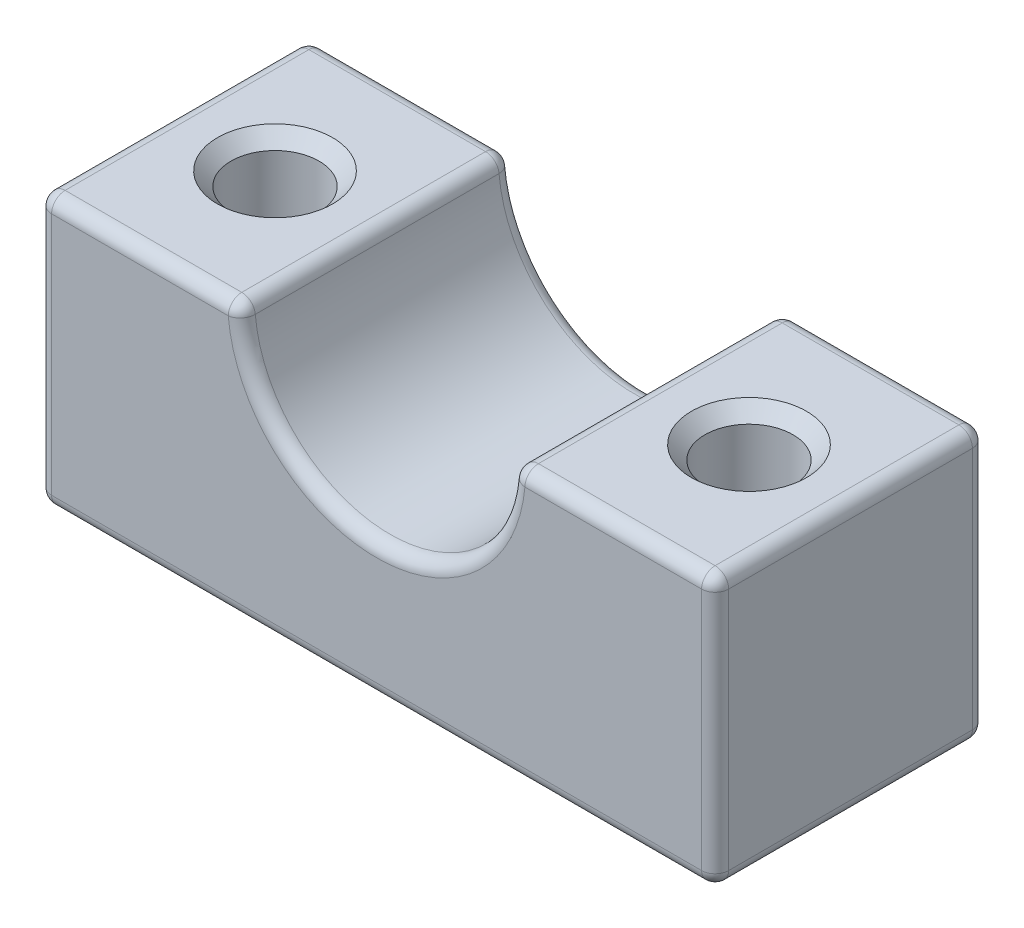
ISO-10303-21;
HEADER;
FILE_DESCRIPTION(('STEP AP214'),'2;1');
FILE_NAME('part.step','',(''),(''),'','','');
FILE_SCHEMA(('AUTOMOTIVE_DESIGN { 1 0 10303 214 1 1 1 1 }'));
ENDSEC;
DATA;
#1=APPLICATION_CONTEXT('core data for automotive mechanical design processes');
#2=APPLICATION_PROTOCOL_DEFINITION('international standard','automotive_design',2000,#1);
#3=PRODUCT_CONTEXT('',#1,'mechanical');
#4=PRODUCT('Part','Part','',(#3));
#5=PRODUCT_RELATED_PRODUCT_CATEGORY('part','',(#4));
#6=PRODUCT_DEFINITION_FORMATION('','',#4);
#7=PRODUCT_DEFINITION_CONTEXT('part definition',#1,'design');
#8=PRODUCT_DEFINITION('design','',#6,#7);
#9=PRODUCT_DEFINITION_SHAPE('','',#8);
#10=(LENGTH_UNIT() NAMED_UNIT(*) SI_UNIT(.MILLI.,.METRE.));
#11=(NAMED_UNIT(*) PLANE_ANGLE_UNIT() SI_UNIT($,.RADIAN.));
#12=(NAMED_UNIT(*) SI_UNIT($,.STERADIAN.) SOLID_ANGLE_UNIT());
#13=UNCERTAINTY_MEASURE_WITH_UNIT(LENGTH_MEASURE(1.E-05),#10,'distance_accuracy_value','');
#14=(GEOMETRIC_REPRESENTATION_CONTEXT(3) GLOBAL_UNCERTAINTY_ASSIGNED_CONTEXT((#13)) GLOBAL_UNIT_ASSIGNED_CONTEXT((#10,
#11,#12)) REPRESENTATION_CONTEXT('',''));
#15=CARTESIAN_POINT('',(0.,0.,0.));
#16=DIRECTION('',(0.,0.,1.));
#17=DIRECTION('',(1.,0.,0.));
#18=AXIS2_PLACEMENT_3D('',#15,#16,#17);
#19=CARTESIAN_POINT('',(0.,0.,40.));
#20=DIRECTION('',(0.,0.,-1.));
#21=DIRECTION('',(-1.,0.,0.));
#22=AXIS2_PLACEMENT_3D('',#19,#20,#21);
#23=CYLINDRICAL_SURFACE('',#22,20.);
#24=DIRECTION('',(0.,0.,-1.));
#25=VECTOR('',#24,1.);
#26=CARTESIAN_POINT('',(19.9171839092788,-1.81818181818182,40.));
#27=LINE('',#26,#25);
#28=CARTESIAN_POINT('',(19.9171839092788,-1.81818181818182,38.));
#29=VERTEX_POINT('',#28);
#30=CARTESIAN_POINT('',(19.9171839092788,-1.81818181818182,2.));
#31=VERTEX_POINT('',#30);
#32=EDGE_CURVE('E183',#29,#31,#27,.T.);
#33=ORIENTED_EDGE('',*,*,#32,.T.);
#34=CARTESIAN_POINT('',(0.,0.,2.));
#35=DIRECTION('',(0.,0.,1.));
#36=DIRECTION('',(1.,0.,0.));
#37=AXIS2_PLACEMENT_3D('',#34,#35,#36);
#38=CIRCLE('',#37,20.);
#39=CARTESIAN_POINT('',(-19.9171839092788,-1.81818181818182,2.));
#40=VERTEX_POINT('',#39);
#41=EDGE_CURVE('E178',#31,#40,#38,.F.);
#42=ORIENTED_EDGE('',*,*,#41,.T.);
#43=DIRECTION('',(0.,0.,-1.));
#44=VECTOR('',#43,1.);
#45=CARTESIAN_POINT('',(-19.9171839092788,-1.81818181818182,40.));
#46=LINE('',#45,#44);
#47=CARTESIAN_POINT('',(-19.9171839092788,-1.81818181818182,38.));
#48=VERTEX_POINT('',#47);
#49=EDGE_CURVE('E171',#40,#48,#46,.F.);
#50=ORIENTED_EDGE('',*,*,#49,.T.);
#51=CARTESIAN_POINT('',(0.,0.,38.));
#52=DIRECTION('',(0.,0.,1.));
#53=DIRECTION('',(1.,0.,0.));
#54=AXIS2_PLACEMENT_3D('',#51,#52,#53);
#55=CIRCLE('',#54,20.);
#56=EDGE_CURVE('E175',#48,#29,#55,.T.);
#57=ORIENTED_EDGE('',*,*,#56,.T.);
#58=EDGE_LOOP('',(#33,#42,#50,#57));
#59=FACE_BOUND('',#58,.T.);
#60=ADVANCED_FACE('F46',(#59),#23,.F.);
#61=CARTESIAN_POINT('',(0.,0.,40.));
#62=DIRECTION('',(0.,1.,0.));
#63=DIRECTION('',(0.,0.,1.));
#64=AXIS2_PLACEMENT_3D('',#61,#62,#63);
#65=PLANE('',#64);
#66=DIRECTION('',(0.,0.,-1.));
#67=VECTOR('',#66,1.);
#68=CARTESIAN_POINT('',(-21.9089023002067,0.,40.));
#69=LINE('',#68,#67);
#70=CARTESIAN_POINT('',(-21.9089023002067,0.,38.));
#71=VERTEX_POINT('',#70);
#72=CARTESIAN_POINT('',(-21.9089023002067,0.,2.));
#73=VERTEX_POINT('',#72);
#74=EDGE_CURVE('E191',#71,#73,#69,.T.);
#75=ORIENTED_EDGE('',*,*,#74,.T.);
#76=DIRECTION('',(1.,0.,0.));
#77=VECTOR('',#76,1.);
#78=CARTESIAN_POINT('',(-50.,0.,2.));
#79=LINE('',#78,#77);
#80=CARTESIAN_POINT('',(-48.,0.,2.));
#81=VERTEX_POINT('',#80);
#82=EDGE_CURVE('E245',#73,#81,#79,.F.);
#83=ORIENTED_EDGE('',*,*,#82,.T.);
#84=DIRECTION('',(0.,0.,-1.));
#85=VECTOR('',#84,1.);
#86=CARTESIAN_POINT('',(-48.,0.,40.));
#87=LINE('',#86,#85);
#88=CARTESIAN_POINT('',(-48.,0.,38.));
#89=VERTEX_POINT('',#88);
#90=EDGE_CURVE('E240',#81,#89,#87,.F.);
#91=ORIENTED_EDGE('',*,*,#90,.T.);
#92=DIRECTION('',(1.,0.,0.));
#93=VECTOR('',#92,1.);
#94=CARTESIAN_POINT('',(0.,0.,38.));
#95=LINE('',#94,#93);
#96=EDGE_CURVE('E237',#89,#71,#95,.T.);
#97=ORIENTED_EDGE('',*,*,#96,.T.);
#98=EDGE_LOOP('',(#75,#83,#91,#97));
#99=FACE_BOUND('',#98,.T.);
#100=CARTESIAN_POINT('',(-35.,0.,20.));
#101=DIRECTION('',(0.,1.,0.));
#102=DIRECTION('',(0.,0.,1.));
#103=AXIS2_PLACEMENT_3D('',#100,#101,#102);
#104=CIRCLE('',#103,8.50000000000004);
#105=CARTESIAN_POINT('',(-35.,0.,28.5));
#106=VERTEX_POINT('',#105);
#107=EDGE_CURVE('E474',#106,#106,#104,.F.);
#108=ORIENTED_EDGE('',*,*,#107,.T.);
#109=EDGE_LOOP('',(#108));
#110=FACE_BOUND('',#109,.T.);
#111=ADVANCED_FACE('F518',(#99,#110),#65,.T.);
#112=CARTESIAN_POINT('',(-50.,0.,40.));
#113=DIRECTION('',(-1.,0.,0.));
#114=DIRECTION('',(0.,0.,1.));
#115=AXIS2_PLACEMENT_3D('',#112,#113,#114);
#116=PLANE('',#115);
#117=DIRECTION('',(0.,0.,-1.));
#118=VECTOR('',#117,1.);
#119=CARTESIAN_POINT('',(-50.,-2.,40.));
#120=LINE('',#119,#118);
#121=CARTESIAN_POINT('',(-50.,-2.,38.));
#122=VERTEX_POINT('',#121);
#123=CARTESIAN_POINT('',(-50.,-2.,2.));
#124=VERTEX_POINT('',#123);
#125=EDGE_CURVE('E254',#122,#124,#120,.T.);
#126=ORIENTED_EDGE('',*,*,#125,.T.);
#127=DIRECTION('',(0.,1.,0.));
#128=VECTOR('',#127,1.);
#129=CARTESIAN_POINT('',(-50.,-40.,2.));
#130=LINE('',#129,#128);
#131=CARTESIAN_POINT('',(-50.,-38.,2.));
#132=VERTEX_POINT('',#131);
#133=EDGE_CURVE('E258',#124,#132,#130,.F.);
#134=ORIENTED_EDGE('',*,*,#133,.T.);
#135=DIRECTION('',(0.,0.,-1.));
#136=VECTOR('',#135,1.);
#137=CARTESIAN_POINT('',(-50.,-38.,40.));
#138=LINE('',#137,#136);
#139=CARTESIAN_POINT('',(-50.,-38.,38.));
#140=VERTEX_POINT('',#139);
#141=EDGE_CURVE('E251',#132,#140,#138,.F.);
#142=ORIENTED_EDGE('',*,*,#141,.T.);
#143=DIRECTION('',(0.,1.,0.));
#144=VECTOR('',#143,1.);
#145=CARTESIAN_POINT('',(-50.,0.,38.));
#146=LINE('',#145,#144);
#147=EDGE_CURVE('E248',#140,#122,#146,.T.);
#148=ORIENTED_EDGE('',*,*,#147,.T.);
#149=EDGE_LOOP('',(#126,#134,#142,#148));
#150=FACE_BOUND('',#149,.T.);
#151=ADVANCED_FACE('F524',(#150),#116,.T.);
#152=CARTESIAN_POINT('',(0.,-40.,40.));
#153=DIRECTION('',(0.,1.,0.));
#154=DIRECTION('',(-1.,0.,0.));
#155=AXIS2_PLACEMENT_3D('',#152,#153,#154);
#156=PLANE('',#155);
#157=DIRECTION('',(1.,0.,0.));
#158=VECTOR('',#157,1.);
#159=CARTESIAN_POINT('',(-50.,-40.,38.));
#160=LINE('',#159,#158);
#161=CARTESIAN_POINT('',(48.,-40.,38.));
#162=VERTEX_POINT('',#161);
#163=CARTESIAN_POINT('',(-48.,-40.,38.));
#164=VERTEX_POINT('',#163);
#165=EDGE_CURVE('E261',#162,#164,#160,.F.);
#166=ORIENTED_EDGE('',*,*,#165,.T.);
#167=DIRECTION('',(0.,0.,-1.));
#168=VECTOR('',#167,1.);
#169=CARTESIAN_POINT('',(-48.,-40.,0.));
#170=LINE('',#169,#168);
#171=CARTESIAN_POINT('',(-48.,-40.,2.));
#172=VERTEX_POINT('',#171);
#173=EDGE_CURVE('E270',#164,#172,#170,.T.);
#174=ORIENTED_EDGE('',*,*,#173,.T.);
#175=DIRECTION('',(1.,0.,0.));
#176=VECTOR('',#175,1.);
#177=CARTESIAN_POINT('',(0.,-40.,2.));
#178=LINE('',#177,#176);
#179=CARTESIAN_POINT('',(48.,-40.,2.));
#180=VERTEX_POINT('',#179);
#181=EDGE_CURVE('E267',#172,#180,#178,.T.);
#182=ORIENTED_EDGE('',*,*,#181,.T.);
#183=DIRECTION('',(0.,0.,-1.));
#184=VECTOR('',#183,1.);
#185=CARTESIAN_POINT('',(48.,-40.,40.));
#186=LINE('',#185,#184);
#187=EDGE_CURVE('E264',#180,#162,#186,.F.);
#188=ORIENTED_EDGE('',*,*,#187,.T.);
#189=EDGE_LOOP('',(#166,#174,#182,#188));
#190=FACE_BOUND('',#189,.T.);
#191=CARTESIAN_POINT('',(-35.,-40.,20.));
#192=DIRECTION('',(0.,1.,0.));
#193=DIRECTION('',(-1.,0.,0.));
#194=AXIS2_PLACEMENT_3D('',#191,#192,#193);
#195=CIRCLE('',#194,8.49999999999999);
#196=CARTESIAN_POINT('',(-43.5,-40.,20.));
#197=VERTEX_POINT('',#196);
#198=EDGE_CURVE('E470',#197,#197,#195,.T.);
#199=ORIENTED_EDGE('',*,*,#198,.T.);
#200=EDGE_LOOP('',(#199));
#201=FACE_BOUND('',#200,.T.);
#202=CARTESIAN_POINT('',(35.,-40.,20.));
#203=DIRECTION('',(0.,1.,0.));
#204=DIRECTION('',(-1.,0.,0.));
#205=AXIS2_PLACEMENT_3D('',#202,#203,#204);
#206=CIRCLE('',#205,8.50000000000001);
#207=CARTESIAN_POINT('',(26.5,-40.,20.));
#208=VERTEX_POINT('',#207);
#209=EDGE_CURVE('E466',#208,#208,#206,.T.);
#210=ORIENTED_EDGE('',*,*,#209,.T.);
#211=EDGE_LOOP('',(#210));
#212=FACE_BOUND('',#211,.T.);
#213=CARTESIAN_POINT('',(0.,-40.,30.));
#214=DIRECTION('',(0.,1.,0.));
#215=DIRECTION('',(-1.,0.,0.));
#216=AXIS2_PLACEMENT_3D('',#213,#214,#215);
#217=CIRCLE('',#216,6.99999999999999);
#218=CARTESIAN_POINT('',(-7.,-40.,30.));
#219=VERTEX_POINT('',#218);
#220=EDGE_CURVE('E462',#219,#219,#217,.T.);
#221=ORIENTED_EDGE('',*,*,#220,.T.);
#222=EDGE_LOOP('',(#221));
#223=FACE_BOUND('',#222,.T.);
#224=ADVANCED_FACE('F686',(#190,#201,#212,#223),#156,.F.);
#225=CARTESIAN_POINT('',(50.,0.,40.));
#226=DIRECTION('',(-1.,0.,0.));
#227=DIRECTION('',(0.,0.,1.));
#228=AXIS2_PLACEMENT_3D('',#225,#226,#227);
#229=PLANE('',#228);
#230=DIRECTION('',(0.,0.,-1.));
#231=VECTOR('',#230,1.);
#232=CARTESIAN_POINT('',(50.,-38.,40.));
#233=LINE('',#232,#231);
#234=CARTESIAN_POINT('',(50.,-38.,38.));
#235=VERTEX_POINT('',#234);
#236=CARTESIAN_POINT('',(50.,-38.,2.));
#237=VERTEX_POINT('',#236);
#238=EDGE_CURVE('E299',#235,#237,#233,.T.);
#239=ORIENTED_EDGE('',*,*,#238,.T.);
#240=DIRECTION('',(0.,1.,0.));
#241=VECTOR('',#240,1.);
#242=CARTESIAN_POINT('',(50.,0.,2.));
#243=LINE('',#242,#241);
#244=CARTESIAN_POINT('',(50.,-2.,2.));
#245=VERTEX_POINT('',#244);
#246=EDGE_CURVE('E303',#237,#245,#243,.T.);
#247=ORIENTED_EDGE('',*,*,#246,.T.);
#248=DIRECTION('',(0.,0.,-1.));
#249=VECTOR('',#248,1.);
#250=CARTESIAN_POINT('',(50.,-2.,40.));
#251=LINE('',#250,#249);
#252=CARTESIAN_POINT('',(50.,-2.,38.));
#253=VERTEX_POINT('',#252);
#254=EDGE_CURVE('E296',#245,#253,#251,.F.);
#255=ORIENTED_EDGE('',*,*,#254,.T.);
#256=DIRECTION('',(0.,1.,0.));
#257=VECTOR('',#256,1.);
#258=CARTESIAN_POINT('',(50.,-40.,38.));
#259=LINE('',#258,#257);
#260=EDGE_CURVE('E293',#253,#235,#259,.F.);
#261=ORIENTED_EDGE('',*,*,#260,.T.);
#262=EDGE_LOOP('',(#239,#247,#255,#261));
#263=FACE_BOUND('',#262,.T.);
#264=ADVANCED_FACE('F712',(#263),#229,.F.);
#265=DIRECTION('',(1.,0.,0.));
#266=VECTOR('',#265,1.);
#267=CARTESIAN_POINT('',(20.,0.,2.));
#268=LINE('',#267,#266);
#269=CARTESIAN_POINT('',(48.,0.,2.));
#270=VERTEX_POINT('',#269);
#271=CARTESIAN_POINT('',(21.9089023002066,0.,2.));
#272=VERTEX_POINT('',#271);
#273=EDGE_CURVE('E230',#270,#272,#268,.F.);
#274=ORIENTED_EDGE('',*,*,#273,.T.);
#275=DIRECTION('',(0.,0.,-1.));
#276=VECTOR('',#275,1.);
#277=CARTESIAN_POINT('',(21.9089023002066,0.,40.));
#278=LINE('',#277,#276);
#279=CARTESIAN_POINT('',(21.9089023002066,0.,38.));
#280=VERTEX_POINT('',#279);
#281=EDGE_CURVE('E233',#272,#280,#278,.F.);
#282=ORIENTED_EDGE('',*,*,#281,.T.);
#283=DIRECTION('',(1.,0.,0.));
#284=VECTOR('',#283,1.);
#285=CARTESIAN_POINT('',(0.,0.,38.));
#286=LINE('',#285,#284);
#287=CARTESIAN_POINT('',(48.,0.,38.));
#288=VERTEX_POINT('',#287);
#289=EDGE_CURVE('E224',#280,#288,#286,.T.);
#290=ORIENTED_EDGE('',*,*,#289,.T.);
#291=DIRECTION('',(0.,0.,-1.));
#292=VECTOR('',#291,1.);
#293=CARTESIAN_POINT('',(48.,0.,0.));
#294=LINE('',#293,#292);
#295=EDGE_CURVE('E227',#288,#270,#294,.T.);
#296=ORIENTED_EDGE('',*,*,#295,.T.);
#297=EDGE_LOOP('',(#274,#282,#290,#296));
#298=FACE_BOUND('',#297,.T.);
#299=CARTESIAN_POINT('',(35.,0.,20.));
#300=DIRECTION('',(0.,1.,0.));
#301=DIRECTION('',(0.,0.,1.));
#302=AXIS2_PLACEMENT_3D('',#299,#300,#301);
#303=CIRCLE('',#302,8.50000000000004);
#304=CARTESIAN_POINT('',(35.,0.,28.5));
#305=VERTEX_POINT('',#304);
#306=EDGE_CURVE('E216',#305,#305,#303,.F.);
#307=ORIENTED_EDGE('',*,*,#306,.T.);
#308=EDGE_LOOP('',(#307));
#309=FACE_BOUND('',#308,.T.);
#310=ADVANCED_FACE('F489',(#298,#309),#65,.T.);
#311=CARTESIAN_POINT('',(0.,0.,40.));
#312=DIRECTION('',(0.,0.,1.));
#313=DIRECTION('',(1.,0.,0.));
#314=AXIS2_PLACEMENT_3D('',#311,#312,#313);
#315=PLANE('',#314);
#316=DIRECTION('',(0.,1.,0.));
#317=VECTOR('',#316,1.);
#318=CARTESIAN_POINT('',(48.,0.,40.));
#319=LINE('',#318,#317);
#320=CARTESIAN_POINT('',(48.,-38.,40.));
#321=VERTEX_POINT('',#320);
#322=CARTESIAN_POINT('',(48.,-2.,40.));
#323=VERTEX_POINT('',#322);
#324=EDGE_CURVE('E56',#321,#323,#319,.T.);
#325=ORIENTED_EDGE('',*,*,#324,.T.);
#326=DIRECTION('',(1.,0.,0.));
#327=VECTOR('',#326,1.);
#328=CARTESIAN_POINT('',(0.,-2.,40.));
#329=LINE('',#328,#327);
#330=CARTESIAN_POINT('',(21.9089023002066,-2.,40.));
#331=VERTEX_POINT('',#330);
#332=EDGE_CURVE('E11',#323,#331,#329,.F.);
#333=ORIENTED_EDGE('',*,*,#332,.T.);
#334=CARTESIAN_POINT('',(0.,0.,40.));
#335=DIRECTION('',(0.,0.,1.));
#336=DIRECTION('',(1.,0.,0.));
#337=AXIS2_PLACEMENT_3D('',#334,#335,#336);
#338=CIRCLE('',#337,22.);
#339=CARTESIAN_POINT('',(-21.9089023002067,-2.,40.));
#340=VERTEX_POINT('',#339);
#341=EDGE_CURVE('E306',#331,#340,#338,.F.);
#342=ORIENTED_EDGE('',*,*,#341,.T.);
#343=DIRECTION('',(1.,0.,0.));
#344=VECTOR('',#343,1.);
#345=CARTESIAN_POINT('',(0.,-2.,40.));
#346=LINE('',#345,#344);
#347=CARTESIAN_POINT('',(-48.,-2.,40.));
#348=VERTEX_POINT('',#347);
#349=EDGE_CURVE('E309',#340,#348,#346,.F.);
#350=ORIENTED_EDGE('',*,*,#349,.T.);
#351=DIRECTION('',(0.,1.,0.));
#352=VECTOR('',#351,1.);
#353=CARTESIAN_POINT('',(-48.,0.,40.));
#354=LINE('',#353,#352);
#355=CARTESIAN_POINT('',(-48.,-38.,40.));
#356=VERTEX_POINT('',#355);
#357=EDGE_CURVE('E312',#348,#356,#354,.F.);
#358=ORIENTED_EDGE('',*,*,#357,.T.);
#359=DIRECTION('',(1.,0.,0.));
#360=VECTOR('',#359,1.);
#361=CARTESIAN_POINT('',(50.,-38.,40.));
#362=LINE('',#361,#360);
#363=EDGE_CURVE('E67',#356,#321,#362,.T.);
#364=ORIENTED_EDGE('',*,*,#363,.T.);
#365=EDGE_LOOP('',(#325,#333,#342,#350,#358,#364));
#366=FACE_BOUND('',#365,.T.);
#367=ADVANCED_FACE('F513',(#366),#315,.T.);
#368=CARTESIAN_POINT('',(0.,0.,0.));
#369=DIRECTION('',(0.,0.,1.));
#370=DIRECTION('',(1.,0.,0.));
#371=AXIS2_PLACEMENT_3D('',#368,#369,#370);
#372=PLANE('',#371);
#373=DIRECTION('',(1.,0.,0.));
#374=VECTOR('',#373,1.);
#375=CARTESIAN_POINT('',(-20.,-2.,0.));
#376=LINE('',#375,#374);
#377=CARTESIAN_POINT('',(-48.,-2.,0.));
#378=VERTEX_POINT('',#377);
#379=CARTESIAN_POINT('',(-21.9089023002067,-2.,0.));
#380=VERTEX_POINT('',#379);
#381=EDGE_CURVE('E286',#378,#380,#376,.T.);
#382=ORIENTED_EDGE('',*,*,#381,.T.);
#383=CARTESIAN_POINT('',(0.,0.,0.));
#384=DIRECTION('',(0.,0.,1.));
#385=DIRECTION('',(1.,0.,0.));
#386=AXIS2_PLACEMENT_3D('',#383,#384,#385);
#387=CIRCLE('',#386,22.);
#388=CARTESIAN_POINT('',(21.9089023002066,-2.,0.));
#389=VERTEX_POINT('',#388);
#390=EDGE_CURVE('E290',#380,#389,#387,.T.);
#391=ORIENTED_EDGE('',*,*,#390,.T.);
#392=DIRECTION('',(1.,0.,0.));
#393=VECTOR('',#392,1.);
#394=CARTESIAN_POINT('',(50.,-2.,0.));
#395=LINE('',#394,#393);
#396=CARTESIAN_POINT('',(48.,-2.,0.));
#397=VERTEX_POINT('',#396);
#398=EDGE_CURVE('E277',#389,#397,#395,.T.);
#399=ORIENTED_EDGE('',*,*,#398,.T.);
#400=DIRECTION('',(0.,1.,0.));
#401=VECTOR('',#400,1.);
#402=CARTESIAN_POINT('',(48.,0.,0.));
#403=LINE('',#402,#401);
#404=CARTESIAN_POINT('',(48.,-38.,0.));
#405=VERTEX_POINT('',#404);
#406=EDGE_CURVE('E274',#397,#405,#403,.F.);
#407=ORIENTED_EDGE('',*,*,#406,.T.);
#408=DIRECTION('',(1.,0.,0.));
#409=VECTOR('',#408,1.);
#410=CARTESIAN_POINT('',(0.,-38.,0.));
#411=LINE('',#410,#409);
#412=CARTESIAN_POINT('',(-48.,-38.,0.));
#413=VERTEX_POINT('',#412);
#414=EDGE_CURVE('E280',#405,#413,#411,.F.);
#415=ORIENTED_EDGE('',*,*,#414,.T.);
#416=DIRECTION('',(0.,1.,0.));
#417=VECTOR('',#416,1.);
#418=CARTESIAN_POINT('',(-48.,0.,0.));
#419=LINE('',#418,#417);
#420=EDGE_CURVE('E283',#413,#378,#419,.T.);
#421=ORIENTED_EDGE('',*,*,#420,.T.);
#422=EDGE_LOOP('',(#382,#391,#399,#407,#415,#421));
#423=FACE_BOUND('',#422,.T.);
#424=ADVANCED_FACE('F502',(#423),#372,.F.);
#425=CARTESIAN_POINT('',(35.,-40.001,20.));
#426=DIRECTION('',(0.,1.,0.));
#427=DIRECTION('',(0.,0.,1.));
#428=AXIS2_PLACEMENT_3D('',#425,#426,#427);
#429=CYLINDRICAL_SURFACE('',#428,6.5);
#430=CARTESIAN_POINT('',(35.,-38.,20.));
#431=DIRECTION('',(0.,1.,0.));
#432=DIRECTION('',(0.,0.,1.));
#433=AXIS2_PLACEMENT_3D('',#430,#431,#432);
#434=CIRCLE('',#433,6.5);
#435=CARTESIAN_POINT('',(35.,-38.,26.5));
#436=VERTEX_POINT('',#435);
#437=EDGE_CURVE('E482',#436,#436,#434,.F.);
#438=ORIENTED_EDGE('',*,*,#437,.T.);
#439=EDGE_LOOP('',(#438));
#440=FACE_BOUND('',#439,.T.);
#441=CARTESIAN_POINT('',(35.,-2.00000000000002,20.));
#442=DIRECTION('',(0.,1.,0.));
#443=DIRECTION('',(0.,0.,1.));
#444=AXIS2_PLACEMENT_3D('',#441,#442,#443);
#445=CIRCLE('',#444,6.5);
#446=CARTESIAN_POINT('',(35.,-2.00000000000002,26.5));
#447=VERTEX_POINT('',#446);
#448=EDGE_CURVE('E478',#447,#447,#445,.T.);
#449=ORIENTED_EDGE('',*,*,#448,.T.);
#450=EDGE_LOOP('',(#449));
#451=FACE_BOUND('',#450,.T.);
#452=ADVANCED_FACE('F499',(#440,#451),#429,.F.);
#453=CARTESIAN_POINT('',(-35.,-40.001,20.));
#454=DIRECTION('',(0.,1.,0.));
#455=DIRECTION('',(0.,0.,1.));
#456=AXIS2_PLACEMENT_3D('',#453,#454,#455);
#457=CYLINDRICAL_SURFACE('',#456,6.5);
#458=CARTESIAN_POINT('',(-35.,-38.,20.));
#459=DIRECTION('',(0.,1.,0.));
#460=DIRECTION('',(0.,0.,1.));
#461=AXIS2_PLACEMENT_3D('',#458,#459,#460);
#462=CIRCLE('',#461,6.5);
#463=CARTESIAN_POINT('',(-35.,-38.,26.5));
#464=VERTEX_POINT('',#463);
#465=EDGE_CURVE('E456',#464,#464,#462,.F.);
#466=ORIENTED_EDGE('',*,*,#465,.T.);
#467=EDGE_LOOP('',(#466));
#468=FACE_BOUND('',#467,.T.);
#469=CARTESIAN_POINT('',(-35.,-2.00000000000002,20.));
#470=DIRECTION('',(0.,1.,0.));
#471=DIRECTION('',(0.,0.,1.));
#472=AXIS2_PLACEMENT_3D('',#469,#470,#471);
#473=CIRCLE('',#472,6.5);
#474=CARTESIAN_POINT('',(-35.,-2.00000000000002,26.5));
#475=VERTEX_POINT('',#474);
#476=EDGE_CURVE('E450',#475,#475,#473,.T.);
#477=ORIENTED_EDGE('',*,*,#476,.T.);
#478=EDGE_LOOP('',(#477));
#479=FACE_BOUND('',#478,.T.);
#480=ADVANCED_FACE('F501',(#468,#479),#457,.F.);
#481=CARTESIAN_POINT('',(0.,-25.,30.));
#482=DIRECTION('',(0.,-1.,0.));
#483=DIRECTION('',(0.,0.,-1.));
#484=AXIS2_PLACEMENT_3D('',#481,#482,#483);
#485=CYLINDRICAL_SURFACE('',#484,5.);
#486=CARTESIAN_POINT('',(0.,-38.,30.));
#487=DIRECTION('',(0.,1.,0.));
#488=DIRECTION('',(0.,0.,1.));
#489=AXIS2_PLACEMENT_3D('',#486,#487,#488);
#490=CIRCLE('',#489,5.);
#491=CARTESIAN_POINT('',(0.,-38.,35.));
#492=VERTEX_POINT('',#491);
#493=EDGE_CURVE('E212',#492,#492,#490,.F.);
#494=ORIENTED_EDGE('',*,*,#493,.T.);
#495=EDGE_LOOP('',(#494));
#496=FACE_BOUND('',#495,.T.);
#497=CARTESIAN_POINT('',(0.,-25.,30.));
#498=DIRECTION('',(0.,-1.,0.));
#499=DIRECTION('',(0.,0.,-1.));
#500=AXIS2_PLACEMENT_3D('',#497,#498,#499);
#501=CIRCLE('',#500,5.);
#502=CARTESIAN_POINT('',(0.,-25.,25.));
#503=VERTEX_POINT('',#502);
#504=EDGE_CURVE('E443',#503,#503,#501,.T.);
#505=ORIENTED_EDGE('',*,*,#504,.F.);
#506=EDGE_LOOP('',(#505));
#507=FACE_BOUND('',#506,.T.);
#508=ADVANCED_FACE('F509',(#496,#507),#485,.F.);
#509=CARTESIAN_POINT('',(0.,-25.,30.));
#510=DIRECTION('',(0.,-1.,0.));
#511=DIRECTION('',(0.,0.,-1.));
#512=AXIS2_PLACEMENT_3D('',#509,#510,#511);
#513=PLANE('',#512);
#514=ORIENTED_EDGE('',*,*,#504,.T.);
#515=EDGE_LOOP('',(#514));
#516=FACE_BOUND('',#515,.T.);
#517=ADVANCED_FACE('F538',(#516),#513,.T.);
#518=CARTESIAN_POINT('',(-35.,-38.,20.));
#519=DIRECTION('',(0.,-1.,0.));
#520=DIRECTION('',(0.,0.,-1.));
#521=AXIS2_PLACEMENT_3D('',#518,#519,#520);
#522=CONICAL_SURFACE('',#521,6.5,0.78539816339745);
#523=ORIENTED_EDGE('',*,*,#198,.F.);
#524=EDGE_LOOP('',(#523));
#525=FACE_BOUND('',#524,.T.);
#526=ORIENTED_EDGE('',*,*,#465,.F.);
#527=EDGE_LOOP('',(#526));
#528=FACE_BOUND('',#527,.T.);
#529=ADVANCED_FACE('F531',(#525,#528),#522,.F.);
#530=CARTESIAN_POINT('',(-35.,-2.00000000000002,20.));
#531=DIRECTION('',(0.,1.,0.));
#532=DIRECTION('',(0.,0.,1.));
#533=AXIS2_PLACEMENT_3D('',#530,#531,#532);
#534=CONICAL_SURFACE('',#533,6.5,0.785398163397453);
#535=ORIENTED_EDGE('',*,*,#107,.F.);
#536=EDGE_LOOP('',(#535));
#537=FACE_BOUND('',#536,.T.);
#538=ORIENTED_EDGE('',*,*,#476,.F.);
#539=EDGE_LOOP('',(#538));
#540=FACE_BOUND('',#539,.T.);
#541=ADVANCED_FACE('F537',(#537,#540),#534,.F.);
#542=CARTESIAN_POINT('',(35.,-38.,20.));
#543=DIRECTION('',(0.,-1.,0.));
#544=DIRECTION('',(0.,0.,-1.));
#545=AXIS2_PLACEMENT_3D('',#542,#543,#544);
#546=CONICAL_SURFACE('',#545,6.5,0.78539816339745);
#547=ORIENTED_EDGE('',*,*,#209,.F.);
#548=EDGE_LOOP('',(#547));
#549=FACE_BOUND('',#548,.T.);
#550=ORIENTED_EDGE('',*,*,#437,.F.);
#551=EDGE_LOOP('',(#550));
#552=FACE_BOUND('',#551,.T.);
#553=ADVANCED_FACE('F495',(#549,#552),#546,.F.);
#554=CARTESIAN_POINT('',(35.,-2.00000000000002,20.));
#555=DIRECTION('',(0.,1.,0.));
#556=DIRECTION('',(0.,0.,1.));
#557=AXIS2_PLACEMENT_3D('',#554,#555,#556);
#558=CONICAL_SURFACE('',#557,6.5,0.785398163397453);
#559=ORIENTED_EDGE('',*,*,#306,.F.);
#560=EDGE_LOOP('',(#559));
#561=FACE_BOUND('',#560,.T.);
#562=ORIENTED_EDGE('',*,*,#448,.F.);
#563=EDGE_LOOP('',(#562));
#564=FACE_BOUND('',#563,.T.);
#565=ADVANCED_FACE('F491',(#561,#564),#558,.F.);
#566=CARTESIAN_POINT('',(0.,-38.,30.));
#567=DIRECTION('',(0.,-1.,0.));
#568=DIRECTION('',(0.,0.,-1.));
#569=AXIS2_PLACEMENT_3D('',#566,#567,#568);
#570=CONICAL_SURFACE('',#569,5.,0.78539816339745);
#571=ORIENTED_EDGE('',*,*,#220,.F.);
#572=EDGE_LOOP('',(#571));
#573=FACE_BOUND('',#572,.T.);
#574=ORIENTED_EDGE('',*,*,#493,.F.);
#575=EDGE_LOOP('',(#574));
#576=FACE_BOUND('',#575,.T.);
#577=ADVANCED_FACE('F494',(#573,#576),#570,.F.);
#578=CARTESIAN_POINT('',(-48.,-38.,40.));
#579=DIRECTION('',(0.,0.,1.));
#580=DIRECTION('',(1.,0.,0.));
#581=AXIS2_PLACEMENT_3D('',#578,#579,#580);
#582=CYLINDRICAL_SURFACE('',#581,2.);
#583=CARTESIAN_POINT('',(-48.,-38.,38.));
#584=DIRECTION('',(0.,0.,1.));
#585=DIRECTION('',(1.,0.,0.));
#586=AXIS2_PLACEMENT_3D('',#583,#584,#585);
#587=CIRCLE('',#586,2.);
#588=EDGE_CURVE('E50',#140,#164,#587,.T.);
#589=ORIENTED_EDGE('',*,*,#588,.F.);
#590=ORIENTED_EDGE('',*,*,#141,.F.);
#591=CARTESIAN_POINT('',(-48.,-38.,2.));
#592=DIRECTION('',(0.,0.,-1.));
#593=DIRECTION('',(-1.,0.,0.));
#594=AXIS2_PLACEMENT_3D('',#591,#592,#593);
#595=CIRCLE('',#594,2.);
#596=EDGE_CURVE('E434',#172,#132,#595,.T.);
#597=ORIENTED_EDGE('',*,*,#596,.F.);
#598=ORIENTED_EDGE('',*,*,#173,.F.);
#599=EDGE_LOOP('',(#589,#590,#597,#598));
#600=FACE_BOUND('',#599,.T.);
#601=ADVANCED_FACE('F48',(#600),#582,.T.);
#602=CARTESIAN_POINT('',(-48.,-38.,38.));
#603=DIRECTION('',(0.,-1.,0.));
#604=DIRECTION('',(0.,0.,-1.));
#605=AXIS2_PLACEMENT_3D('',#602,#603,#604);
#606=SPHERICAL_SURFACE('',#605,2.);
#607=CARTESIAN_POINT('',(-48.,-38.,38.));
#608=DIRECTION('',(0.,-1.,0.));
#609=DIRECTION('',(1.,0.,0.));
#610=AXIS2_PLACEMENT_3D('',#607,#608,#609);
#611=CIRCLE('',#610,2.);
#612=EDGE_CURVE('E427',#140,#356,#611,.F.);
#613=ORIENTED_EDGE('',*,*,#612,.F.);
#614=ORIENTED_EDGE('',*,*,#588,.T.);
#615=CARTESIAN_POINT('',(-48.,-38.,38.));
#616=DIRECTION('',(-1.,0.,0.));
#617=DIRECTION('',(0.,0.,1.));
#618=AXIS2_PLACEMENT_3D('',#615,#616,#617);
#619=CIRCLE('',#618,2.);
#620=EDGE_CURVE('E431',#356,#164,#619,.F.);
#621=ORIENTED_EDGE('',*,*,#620,.F.);
#622=EDGE_LOOP('',(#613,#614,#621));
#623=FACE_BOUND('',#622,.T.);
#624=ADVANCED_FACE('F664',(#623),#606,.T.);
#625=CARTESIAN_POINT('',(-48.,-38.,2.));
#626=DIRECTION('',(-1.,0.,0.));
#627=DIRECTION('',(0.,0.,1.));
#628=AXIS2_PLACEMENT_3D('',#625,#626,#627);
#629=SPHERICAL_SURFACE('',#628,2.);
#630=CARTESIAN_POINT('',(-48.,-38.,2.));
#631=DIRECTION('',(-1.,0.,0.));
#632=DIRECTION('',(0.,0.,1.));
#633=AXIS2_PLACEMENT_3D('',#630,#631,#632);
#634=CIRCLE('',#633,2.);
#635=EDGE_CURVE('E419',#172,#413,#634,.F.);
#636=ORIENTED_EDGE('',*,*,#635,.F.);
#637=ORIENTED_EDGE('',*,*,#596,.T.);
#638=CARTESIAN_POINT('',(-48.,-38.,2.));
#639=DIRECTION('',(0.,-1.,0.));
#640=DIRECTION('',(0.,0.,-1.));
#641=AXIS2_PLACEMENT_3D('',#638,#639,#640);
#642=CIRCLE('',#641,2.);
#643=EDGE_CURVE('E423',#413,#132,#642,.F.);
#644=ORIENTED_EDGE('',*,*,#643,.F.);
#645=EDGE_LOOP('',(#636,#637,#644));
#646=FACE_BOUND('',#645,.T.);
#647=ADVANCED_FACE('F661',(#646),#629,.T.);
#648=CARTESIAN_POINT('',(0.,-38.,38.));
#649=DIRECTION('',(-1.,0.,0.));
#650=DIRECTION('',(0.,-1.,0.));
#651=AXIS2_PLACEMENT_3D('',#648,#649,#650);
#652=CYLINDRICAL_SURFACE('',#651,2.);
#653=ORIENTED_EDGE('',*,*,#620,.T.);
#654=ORIENTED_EDGE('',*,*,#165,.F.);
#655=CARTESIAN_POINT('',(48.,-38.,38.));
#656=DIRECTION('',(1.,0.,0.));
#657=DIRECTION('',(0.,0.,-1.));
#658=AXIS2_PLACEMENT_3D('',#655,#656,#657);
#659=CIRCLE('',#658,2.);
#660=EDGE_CURVE('E411',#321,#162,#659,.T.);
#661=ORIENTED_EDGE('',*,*,#660,.F.);
#662=ORIENTED_EDGE('',*,*,#363,.F.);
#663=EDGE_LOOP('',(#653,#654,#661,#662));
#664=FACE_BOUND('',#663,.T.);
#665=ADVANCED_FACE('F657',(#664),#652,.T.);
#666=CARTESIAN_POINT('',(-48.,0.,38.));
#667=DIRECTION('',(0.,1.,0.));
#668=DIRECTION('',(0.,0.,1.));
#669=AXIS2_PLACEMENT_3D('',#666,#667,#668);
#670=CYLINDRICAL_SURFACE('',#669,2.);
#671=ORIENTED_EDGE('',*,*,#612,.T.);
#672=ORIENTED_EDGE('',*,*,#357,.F.);
#673=CARTESIAN_POINT('',(-48.,-2.,38.));
#674=DIRECTION('',(0.,1.,0.));
#675=DIRECTION('',(0.,0.,1.));
#676=AXIS2_PLACEMENT_3D('',#673,#674,#675);
#677=CIRCLE('',#676,2.);
#678=EDGE_CURVE('E407',#122,#348,#677,.T.);
#679=ORIENTED_EDGE('',*,*,#678,.F.);
#680=ORIENTED_EDGE('',*,*,#147,.F.);
#681=EDGE_LOOP('',(#671,#672,#679,#680));
#682=FACE_BOUND('',#681,.T.);
#683=ADVANCED_FACE('F653',(#682),#670,.T.);
#684=CARTESIAN_POINT('',(-48.,-2.,40.));
#685=DIRECTION('',(0.,0.,-1.));
#686=DIRECTION('',(-1.,0.,0.));
#687=AXIS2_PLACEMENT_3D('',#684,#685,#686);
#688=CYLINDRICAL_SURFACE('',#687,2.);
#689=CARTESIAN_POINT('',(-48.,-2.,2.));
#690=DIRECTION('',(0.,0.,-1.));
#691=DIRECTION('',(-1.,0.,0.));
#692=AXIS2_PLACEMENT_3D('',#689,#690,#691);
#693=CIRCLE('',#692,2.);
#694=EDGE_CURVE('E399',#124,#81,#693,.T.);
#695=ORIENTED_EDGE('',*,*,#694,.F.);
#696=ORIENTED_EDGE('',*,*,#125,.F.);
#697=CARTESIAN_POINT('',(-48.,-2.,38.));
#698=DIRECTION('',(0.,0.,1.));
#699=DIRECTION('',(1.,0.,0.));
#700=AXIS2_PLACEMENT_3D('',#697,#698,#699);
#701=CIRCLE('',#700,2.);
#702=EDGE_CURVE('E403',#89,#122,#701,.T.);
#703=ORIENTED_EDGE('',*,*,#702,.F.);
#704=ORIENTED_EDGE('',*,*,#90,.F.);
#705=EDGE_LOOP('',(#695,#696,#703,#704));
#706=FACE_BOUND('',#705,.T.);
#707=ADVANCED_FACE('F649',(#706),#688,.T.);
#708=CARTESIAN_POINT('',(-48.,0.,2.));
#709=DIRECTION('',(0.,-1.,0.));
#710=DIRECTION('',(0.,0.,-1.));
#711=AXIS2_PLACEMENT_3D('',#708,#709,#710);
#712=CYLINDRICAL_SURFACE('',#711,2.);
#713=ORIENTED_EDGE('',*,*,#643,.T.);
#714=ORIENTED_EDGE('',*,*,#133,.F.);
#715=CARTESIAN_POINT('',(-48.,-2.,2.));
#716=DIRECTION('',(0.,1.,0.));
#717=DIRECTION('',(0.,0.,1.));
#718=AXIS2_PLACEMENT_3D('',#715,#716,#717);
#719=CIRCLE('',#718,2.);
#720=EDGE_CURVE('E396',#378,#124,#719,.T.);
#721=ORIENTED_EDGE('',*,*,#720,.F.);
#722=ORIENTED_EDGE('',*,*,#420,.F.);
#723=EDGE_LOOP('',(#713,#714,#721,#722));
#724=FACE_BOUND('',#723,.T.);
#725=ADVANCED_FACE('F645',(#724),#712,.T.);
#726=CARTESIAN_POINT('',(0.,-38.,2.));
#727=DIRECTION('',(1.,0.,0.));
#728=DIRECTION('',(0.,1.,0.));
#729=AXIS2_PLACEMENT_3D('',#726,#727,#728);
#730=CYLINDRICAL_SURFACE('',#729,2.);
#731=ORIENTED_EDGE('',*,*,#635,.T.);
#732=ORIENTED_EDGE('',*,*,#414,.F.);
#733=CARTESIAN_POINT('',(48.,-38.,2.));
#734=DIRECTION('',(1.,0.,0.));
#735=DIRECTION('',(0.,0.,-1.));
#736=AXIS2_PLACEMENT_3D('',#733,#734,#735);
#737=CIRCLE('',#736,2.);
#738=EDGE_CURVE('E392',#180,#405,#737,.T.);
#739=ORIENTED_EDGE('',*,*,#738,.F.);
#740=ORIENTED_EDGE('',*,*,#181,.F.);
#741=EDGE_LOOP('',(#731,#732,#739,#740));
#742=FACE_BOUND('',#741,.T.);
#743=ADVANCED_FACE('F641',(#742),#730,.T.);
#744=CARTESIAN_POINT('',(48.,-38.,40.));
#745=DIRECTION('',(0.,0.,-1.));
#746=DIRECTION('',(-1.,0.,0.));
#747=AXIS2_PLACEMENT_3D('',#744,#745,#746);
#748=CYLINDRICAL_SURFACE('',#747,2.);
#749=CARTESIAN_POINT('',(48.,-38.,38.));
#750=DIRECTION('',(0.,0.,1.));
#751=DIRECTION('',(1.,0.,0.));
#752=AXIS2_PLACEMENT_3D('',#749,#750,#751);
#753=CIRCLE('',#752,2.);
#754=EDGE_CURVE('E415',#162,#235,#753,.T.);
#755=ORIENTED_EDGE('',*,*,#754,.F.);
#756=ORIENTED_EDGE('',*,*,#187,.F.);
#757=CARTESIAN_POINT('',(48.,-38.,2.));
#758=DIRECTION('',(0.,0.,-1.));
#759=DIRECTION('',(-1.,0.,0.));
#760=AXIS2_PLACEMENT_3D('',#757,#758,#759);
#761=CIRCLE('',#760,2.);
#762=EDGE_CURVE('E388',#237,#180,#761,.T.);
#763=ORIENTED_EDGE('',*,*,#762,.F.);
#764=ORIENTED_EDGE('',*,*,#238,.F.);
#765=EDGE_LOOP('',(#755,#756,#763,#764));
#766=FACE_BOUND('',#765,.T.);
#767=ADVANCED_FACE('F637',(#766),#748,.T.);
#768=CARTESIAN_POINT('',(48.,-38.,38.));
#769=DIRECTION('',(0.,-1.,0.));
#770=DIRECTION('',(0.,0.,-1.));
#771=AXIS2_PLACEMENT_3D('',#768,#769,#770);
#772=SPHERICAL_SURFACE('',#771,2.);
#773=ORIENTED_EDGE('',*,*,#660,.T.);
#774=ORIENTED_EDGE('',*,*,#754,.T.);
#775=CARTESIAN_POINT('',(48.,-38.,38.));
#776=DIRECTION('',(0.,-1.,0.));
#777=DIRECTION('',(0.,0.,-1.));
#778=AXIS2_PLACEMENT_3D('',#775,#776,#777);
#779=CIRCLE('',#778,2.);
#780=EDGE_CURVE('E384',#321,#235,#779,.F.);
#781=ORIENTED_EDGE('',*,*,#780,.F.);
#782=EDGE_LOOP('',(#773,#774,#781));
#783=FACE_BOUND('',#782,.T.);
#784=ADVANCED_FACE('F633',(#783),#772,.T.);
#785=CARTESIAN_POINT('',(-48.,-2.,38.));
#786=DIRECTION('',(-1.,0.,0.));
#787=DIRECTION('',(0.,0.,1.));
#788=AXIS2_PLACEMENT_3D('',#785,#786,#787);
#789=SPHERICAL_SURFACE('',#788,2.);
#790=ORIENTED_EDGE('',*,*,#702,.T.);
#791=ORIENTED_EDGE('',*,*,#678,.T.);
#792=CARTESIAN_POINT('',(-48.,-2.,38.));
#793=DIRECTION('',(-1.,0.,0.));
#794=DIRECTION('',(0.,0.,1.));
#795=AXIS2_PLACEMENT_3D('',#792,#793,#794);
#796=CIRCLE('',#795,2.);
#797=EDGE_CURVE('E380',#89,#348,#796,.F.);
#798=ORIENTED_EDGE('',*,*,#797,.F.);
#799=EDGE_LOOP('',(#790,#791,#798));
#800=FACE_BOUND('',#799,.T.);
#801=ADVANCED_FACE('F629',(#800),#789,.T.);
#802=CARTESIAN_POINT('',(-48.,-2.,2.));
#803=DIRECTION('',(-1.,0.,0.));
#804=DIRECTION('',(0.,0.,1.));
#805=AXIS2_PLACEMENT_3D('',#802,#803,#804);
#806=SPHERICAL_SURFACE('',#805,2.);
#807=ORIENTED_EDGE('',*,*,#720,.T.);
#808=ORIENTED_EDGE('',*,*,#694,.T.);
#809=CARTESIAN_POINT('',(-48.,-2.,2.));
#810=DIRECTION('',(-1.,0.,0.));
#811=DIRECTION('',(0.,0.,1.));
#812=AXIS2_PLACEMENT_3D('',#809,#810,#811);
#813=CIRCLE('',#812,2.);
#814=EDGE_CURVE('E376',#378,#81,#813,.F.);
#815=ORIENTED_EDGE('',*,*,#814,.F.);
#816=EDGE_LOOP('',(#807,#808,#815));
#817=FACE_BOUND('',#816,.T.);
#818=ADVANCED_FACE('F625',(#817),#806,.T.);
#819=CARTESIAN_POINT('',(48.,-38.,2.));
#820=DIRECTION('',(0.,-1.,0.));
#821=DIRECTION('',(0.,0.,-1.));
#822=AXIS2_PLACEMENT_3D('',#819,#820,#821);
#823=SPHERICAL_SURFACE('',#822,2.);
#824=ORIENTED_EDGE('',*,*,#762,.T.);
#825=ORIENTED_EDGE('',*,*,#738,.T.);
#826=CARTESIAN_POINT('',(48.,-38.,2.));
#827=DIRECTION('',(0.,-1.,0.));
#828=DIRECTION('',(0.,0.,-1.));
#829=AXIS2_PLACEMENT_3D('',#826,#827,#828);
#830=CIRCLE('',#829,2.);
#831=EDGE_CURVE('E372',#237,#405,#830,.F.);
#832=ORIENTED_EDGE('',*,*,#831,.F.);
#833=EDGE_LOOP('',(#824,#825,#832));
#834=FACE_BOUND('',#833,.T.);
#835=ADVANCED_FACE('F621',(#834),#823,.T.);
#836=CARTESIAN_POINT('',(48.,0.,38.));
#837=DIRECTION('',(0.,-1.,0.));
#838=DIRECTION('',(0.,0.,-1.));
#839=AXIS2_PLACEMENT_3D('',#836,#837,#838);
#840=CYLINDRICAL_SURFACE('',#839,2.);
#841=ORIENTED_EDGE('',*,*,#780,.T.);
#842=ORIENTED_EDGE('',*,*,#260,.F.);
#843=CARTESIAN_POINT('',(48.,-2.,38.));
#844=DIRECTION('',(0.,1.,0.));
#845=DIRECTION('',(0.,0.,1.));
#846=AXIS2_PLACEMENT_3D('',#843,#844,#845);
#847=CIRCLE('',#846,2.);
#848=EDGE_CURVE('E364',#323,#253,#847,.T.);
#849=ORIENTED_EDGE('',*,*,#848,.F.);
#850=ORIENTED_EDGE('',*,*,#324,.F.);
#851=EDGE_LOOP('',(#841,#842,#849,#850));
#852=FACE_BOUND('',#851,.T.);
#853=ADVANCED_FACE('F617',(#852),#840,.T.);
#854=CARTESIAN_POINT('',(0.,-2.,38.));
#855=DIRECTION('',(1.,0.,0.));
#856=DIRECTION('',(0.,0.,-1.));
#857=AXIS2_PLACEMENT_3D('',#854,#855,#856);
#858=CYLINDRICAL_SURFACE('',#857,2.);
#859=ORIENTED_EDGE('',*,*,#797,.T.);
#860=ORIENTED_EDGE('',*,*,#349,.F.);
#861=CARTESIAN_POINT('',(-21.9089023002067,-2.,38.));
#862=DIRECTION('',(1.,0.,0.));
#863=DIRECTION('',(0.,0.,-1.));
#864=AXIS2_PLACEMENT_3D('',#861,#862,#863);
#865=CIRCLE('',#864,2.);
#866=EDGE_CURVE('E196',#71,#340,#865,.T.);
#867=ORIENTED_EDGE('',*,*,#866,.F.);
#868=ORIENTED_EDGE('',*,*,#96,.F.);
#869=EDGE_LOOP('',(#859,#860,#867,#868));
#870=FACE_BOUND('',#869,.T.);
#871=ADVANCED_FACE('F614',(#870),#858,.T.);
#872=CARTESIAN_POINT('',(-21.9089023002067,-2.,40.));
#873=DIRECTION('',(0.,0.,-1.));
#874=DIRECTION('',(-1.,0.,0.));
#875=AXIS2_PLACEMENT_3D('',#872,#873,#874);
#876=CYLINDRICAL_SURFACE('',#875,2.);
#877=CARTESIAN_POINT('',(-21.9089023002067,-2.,2.));
#878=DIRECTION('',(0.,0.,-1.));
#879=DIRECTION('',(-1.,0.,0.));
#880=AXIS2_PLACEMENT_3D('',#877,#878,#879);
#881=CIRCLE('',#880,2.);
#882=EDGE_CURVE('E197',#73,#40,#881,.T.);
#883=ORIENTED_EDGE('',*,*,#882,.F.);
#884=ORIENTED_EDGE('',*,*,#74,.F.);
#885=CARTESIAN_POINT('',(-21.9089023002067,-2.,38.));
#886=DIRECTION('',(0.,0.,1.));
#887=DIRECTION('',(1.,0.,0.));
#888=AXIS2_PLACEMENT_3D('',#885,#886,#887);
#889=CIRCLE('',#888,2.);
#890=EDGE_CURVE('E187',#48,#71,#889,.T.);
#891=ORIENTED_EDGE('',*,*,#890,.F.);
#892=ORIENTED_EDGE('',*,*,#49,.F.);
#893=EDGE_LOOP('',(#883,#884,#891,#892));
#894=FACE_BOUND('',#893,.T.);
#895=ADVANCED_FACE('F189',(#894),#876,.T.);
#896=CARTESIAN_POINT('',(0.,-2.,2.));
#897=DIRECTION('',(-1.,0.,0.));
#898=DIRECTION('',(0.,0.,1.));
#899=AXIS2_PLACEMENT_3D('',#896,#897,#898);
#900=CYLINDRICAL_SURFACE('',#899,2.);
#901=ORIENTED_EDGE('',*,*,#814,.T.);
#902=ORIENTED_EDGE('',*,*,#82,.F.);
#903=CARTESIAN_POINT('',(-21.9089023002067,-2.,2.));
#904=DIRECTION('',(1.,0.,0.));
#905=DIRECTION('',(0.,0.,-1.));
#906=AXIS2_PLACEMENT_3D('',#903,#904,#905);
#907=CIRCLE('',#906,2.);
#908=EDGE_CURVE('E357',#380,#73,#907,.T.);
#909=ORIENTED_EDGE('',*,*,#908,.F.);
#910=ORIENTED_EDGE('',*,*,#381,.F.);
#911=EDGE_LOOP('',(#901,#902,#909,#910));
#912=FACE_BOUND('',#911,.T.);
#913=ADVANCED_FACE('F607',(#912),#900,.T.);
#914=CARTESIAN_POINT('',(48.,0.,2.));
#915=DIRECTION('',(0.,1.,0.));
#916=DIRECTION('',(0.,0.,1.));
#917=AXIS2_PLACEMENT_3D('',#914,#915,#916);
#918=CYLINDRICAL_SURFACE('',#917,2.);
#919=ORIENTED_EDGE('',*,*,#831,.T.);
#920=ORIENTED_EDGE('',*,*,#406,.F.);
#921=CARTESIAN_POINT('',(48.,-2.,2.));
#922=DIRECTION('',(0.,1.,0.));
#923=DIRECTION('',(0.,0.,1.));
#924=AXIS2_PLACEMENT_3D('',#921,#922,#923);
#925=CIRCLE('',#924,2.);
#926=EDGE_CURVE('E353',#245,#397,#925,.T.);
#927=ORIENTED_EDGE('',*,*,#926,.F.);
#928=ORIENTED_EDGE('',*,*,#246,.F.);
#929=EDGE_LOOP('',(#919,#920,#927,#928));
#930=FACE_BOUND('',#929,.T.);
#931=ADVANCED_FACE('F603',(#930),#918,.T.);
#932=CARTESIAN_POINT('',(48.,-2.,40.));
#933=DIRECTION('',(0.,0.,1.));
#934=DIRECTION('',(1.,0.,0.));
#935=AXIS2_PLACEMENT_3D('',#932,#933,#934);
#936=CYLINDRICAL_SURFACE('',#935,2.);
#937=CARTESIAN_POINT('',(48.,-2.,38.));
#938=DIRECTION('',(0.,0.,1.));
#939=DIRECTION('',(1.,0.,0.));
#940=AXIS2_PLACEMENT_3D('',#937,#938,#939);
#941=CIRCLE('',#940,2.);
#942=EDGE_CURVE('E368',#253,#288,#941,.T.);
#943=ORIENTED_EDGE('',*,*,#942,.F.);
#944=ORIENTED_EDGE('',*,*,#254,.F.);
#945=CARTESIAN_POINT('',(48.,-2.,2.));
#946=DIRECTION('',(0.,0.,-1.));
#947=DIRECTION('',(-1.,0.,0.));
#948=AXIS2_PLACEMENT_3D('',#945,#946,#947);
#949=CIRCLE('',#948,2.);
#950=EDGE_CURVE('E349',#270,#245,#949,.T.);
#951=ORIENTED_EDGE('',*,*,#950,.F.);
#952=ORIENTED_EDGE('',*,*,#295,.F.);
#953=EDGE_LOOP('',(#943,#944,#951,#952));
#954=FACE_BOUND('',#953,.T.);
#955=ADVANCED_FACE('F599',(#954),#936,.T.);
#956=CARTESIAN_POINT('',(48.,-2.,38.));
#957=DIRECTION('',(1.,0.,0.));
#958=DIRECTION('',(0.,0.,-1.));
#959=AXIS2_PLACEMENT_3D('',#956,#957,#958);
#960=SPHERICAL_SURFACE('',#959,2.);
#961=ORIENTED_EDGE('',*,*,#848,.T.);
#962=ORIENTED_EDGE('',*,*,#942,.T.);
#963=CARTESIAN_POINT('',(48.,-2.,38.));
#964=DIRECTION('',(1.,0.,0.));
#965=DIRECTION('',(0.,0.,-1.));
#966=AXIS2_PLACEMENT_3D('',#963,#964,#965);
#967=CIRCLE('',#966,2.);
#968=EDGE_CURVE('E205',#323,#288,#967,.F.);
#969=ORIENTED_EDGE('',*,*,#968,.F.);
#970=EDGE_LOOP('',(#961,#962,#969));
#971=FACE_BOUND('',#970,.T.);
#972=ADVANCED_FACE('F596',(#971),#960,.T.);
#973=CARTESIAN_POINT('',(-21.9089023002067,-2.,38.));
#974=DIRECTION('',(0.,0.,1.));
#975=DIRECTION('',(1.,0.,0.));
#976=AXIS2_PLACEMENT_3D('',#973,#974,#975);
#977=SPHERICAL_SURFACE('',#976,2.);
#978=ORIENTED_EDGE('',*,*,#890,.T.);
#979=ORIENTED_EDGE('',*,*,#866,.T.);
#980=CARTESIAN_POINT('',(-21.9089023002067,-2.,38.));
#981=DIRECTION('',(-0.0909090909090904,0.995859195463938,0.));
#982=DIRECTION('',(-0.995859195463939,-0.0909090909090905,0.));
#983=AXIS2_PLACEMENT_3D('',#980,#981,#982);
#984=CIRCLE('',#983,2.);
#985=EDGE_CURVE('E200',#48,#340,#984,.F.);
#986=ORIENTED_EDGE('',*,*,#985,.F.);
#987=EDGE_LOOP('',(#978,#979,#986));
#988=FACE_BOUND('',#987,.T.);
#989=ADVANCED_FACE('F201',(#988),#977,.T.);
#990=CARTESIAN_POINT('',(-21.9089023002067,-2.,2.));
#991=DIRECTION('',(0.,0.,-1.));
#992=DIRECTION('',(-1.,0.,0.));
#993=AXIS2_PLACEMENT_3D('',#990,#991,#992);
#994=SPHERICAL_SURFACE('',#993,2.);
#995=ORIENTED_EDGE('',*,*,#908,.T.);
#996=ORIENTED_EDGE('',*,*,#882,.T.);
#997=CARTESIAN_POINT('',(-21.9089023002067,-2.,2.));
#998=DIRECTION('',(-0.0909090909090906,0.995859195463939,0.));
#999=DIRECTION('',(-0.995859195463939,-0.0909090909090906,0.));
#1000=AXIS2_PLACEMENT_3D('',#997,#998,#999);
#1001=CIRCLE('',#1000,2.);
#1002=EDGE_CURVE('E206',#380,#40,#1001,.F.);
#1003=ORIENTED_EDGE('',*,*,#1002,.F.);
#1004=EDGE_LOOP('',(#995,#996,#1003));
#1005=FACE_BOUND('',#1004,.T.);
#1006=ADVANCED_FACE('F589',(#1005),#994,.T.);
#1007=CARTESIAN_POINT('',(48.,-2.,2.));
#1008=DIRECTION('',(1.,0.,0.));
#1009=DIRECTION('',(0.,0.,-1.));
#1010=AXIS2_PLACEMENT_3D('',#1007,#1008,#1009);
#1011=SPHERICAL_SURFACE('',#1010,2.);
#1012=ORIENTED_EDGE('',*,*,#950,.T.);
#1013=ORIENTED_EDGE('',*,*,#926,.T.);
#1014=CARTESIAN_POINT('',(48.,-2.,2.));
#1015=DIRECTION('',(1.,0.,0.));
#1016=DIRECTION('',(0.,0.,-1.));
#1017=AXIS2_PLACEMENT_3D('',#1014,#1015,#1016);
#1018=CIRCLE('',#1017,2.);
#1019=EDGE_CURVE('E339',#270,#397,#1018,.F.);
#1020=ORIENTED_EDGE('',*,*,#1019,.F.);
#1021=EDGE_LOOP('',(#1012,#1013,#1020));
#1022=FACE_BOUND('',#1021,.T.);
#1023=ADVANCED_FACE('F585',(#1022),#1011,.T.);
#1024=CARTESIAN_POINT('',(0.,-2.,38.));
#1025=DIRECTION('',(1.,0.,0.));
#1026=DIRECTION('',(0.,0.,-1.));
#1027=AXIS2_PLACEMENT_3D('',#1024,#1025,#1026);
#1028=CYLINDRICAL_SURFACE('',#1027,2.);
#1029=ORIENTED_EDGE('',*,*,#968,.T.);
#1030=ORIENTED_EDGE('',*,*,#289,.F.);
#1031=CARTESIAN_POINT('',(21.9089023002066,-2.,38.));
#1032=DIRECTION('',(-1.,0.,0.));
#1033=DIRECTION('',(0.,0.,1.));
#1034=AXIS2_PLACEMENT_3D('',#1031,#1032,#1033);
#1035=CIRCLE('',#1034,2.);
#1036=EDGE_CURVE('E335',#331,#280,#1035,.T.);
#1037=ORIENTED_EDGE('',*,*,#1036,.F.);
#1038=ORIENTED_EDGE('',*,*,#332,.F.);
#1039=EDGE_LOOP('',(#1029,#1030,#1037,#1038));
#1040=FACE_BOUND('',#1039,.T.);
#1041=ADVANCED_FACE('F582',(#1040),#1028,.T.);
#1042=CARTESIAN_POINT('',(0.,0.,38.));
#1043=DIRECTION('',(0.,0.,1.));
#1044=DIRECTION('',(1.,0.,0.));
#1045=AXIS2_PLACEMENT_3D('',#1042,#1043,#1044);
#1046=TOROIDAL_SURFACE('',#1045,22.,2.);
#1047=ORIENTED_EDGE('',*,*,#985,.T.);
#1048=ORIENTED_EDGE('',*,*,#341,.F.);
#1049=CARTESIAN_POINT('',(21.9089023002066,-2.,38.));
#1050=DIRECTION('',(0.0909090909090906,0.995859195463939,0.));
#1051=DIRECTION('',(-0.995859195463939,0.0909090909090906,0.));
#1052=AXIS2_PLACEMENT_3D('',#1049,#1050,#1051);
#1053=CIRCLE('',#1052,2.);
#1054=EDGE_CURVE('E209',#29,#331,#1053,.T.);
#1055=ORIENTED_EDGE('',*,*,#1054,.F.);
#1056=ORIENTED_EDGE('',*,*,#56,.F.);
#1057=EDGE_LOOP('',(#1047,#1048,#1055,#1056));
#1058=FACE_BOUND('',#1057,.T.);
#1059=ADVANCED_FACE('F208',(#1058),#1046,.T.);
#1060=CARTESIAN_POINT('',(0.,0.,2.));
#1061=DIRECTION('',(0.,0.,1.));
#1062=DIRECTION('',(1.,0.,0.));
#1063=AXIS2_PLACEMENT_3D('',#1060,#1061,#1062);
#1064=TOROIDAL_SURFACE('',#1063,22.,2.);
#1065=ORIENTED_EDGE('',*,*,#1002,.T.);
#1066=ORIENTED_EDGE('',*,*,#41,.F.);
#1067=CARTESIAN_POINT('',(21.9089023002066,-2.,2.));
#1068=DIRECTION('',(0.0909090909090904,0.995859195463938,0.));
#1069=DIRECTION('',(-0.995859195463939,0.0909090909090905,0.));
#1070=AXIS2_PLACEMENT_3D('',#1067,#1068,#1069);
#1071=CIRCLE('',#1070,2.);
#1072=EDGE_CURVE('E329',#389,#31,#1071,.T.);
#1073=ORIENTED_EDGE('',*,*,#1072,.F.);
#1074=ORIENTED_EDGE('',*,*,#390,.F.);
#1075=EDGE_LOOP('',(#1065,#1066,#1073,#1074));
#1076=FACE_BOUND('',#1075,.T.);
#1077=ADVANCED_FACE('F575',(#1076),#1064,.T.);
#1078=CARTESIAN_POINT('',(0.,-2.,2.));
#1079=DIRECTION('',(-1.,0.,0.));
#1080=DIRECTION('',(0.,0.,1.));
#1081=AXIS2_PLACEMENT_3D('',#1078,#1079,#1080);
#1082=CYLINDRICAL_SURFACE('',#1081,2.);
#1083=ORIENTED_EDGE('',*,*,#1019,.T.);
#1084=ORIENTED_EDGE('',*,*,#398,.F.);
#1085=CARTESIAN_POINT('',(21.9089023002066,-2.,2.));
#1086=DIRECTION('',(-1.,0.,0.));
#1087=DIRECTION('',(0.,0.,1.));
#1088=AXIS2_PLACEMENT_3D('',#1085,#1086,#1087);
#1089=CIRCLE('',#1088,2.);
#1090=EDGE_CURVE('E325',#272,#389,#1089,.T.);
#1091=ORIENTED_EDGE('',*,*,#1090,.F.);
#1092=ORIENTED_EDGE('',*,*,#273,.F.);
#1093=EDGE_LOOP('',(#1083,#1084,#1091,#1092));
#1094=FACE_BOUND('',#1093,.T.);
#1095=ADVANCED_FACE('F571',(#1094),#1082,.T.);
#1096=CARTESIAN_POINT('',(21.9089023002066,-2.,38.));
#1097=DIRECTION('',(0.,0.,1.));
#1098=DIRECTION('',(1.,0.,0.));
#1099=AXIS2_PLACEMENT_3D('',#1096,#1097,#1098);
#1100=SPHERICAL_SURFACE('',#1099,2.);
#1101=ORIENTED_EDGE('',*,*,#1054,.T.);
#1102=ORIENTED_EDGE('',*,*,#1036,.T.);
#1103=CARTESIAN_POINT('',(21.9089023002066,-2.,38.));
#1104=DIRECTION('',(0.,0.,1.));
#1105=DIRECTION('',(1.,0.,0.));
#1106=AXIS2_PLACEMENT_3D('',#1103,#1104,#1105);
#1107=CIRCLE('',#1106,2.);
#1108=EDGE_CURVE('E322',#29,#280,#1107,.F.);
#1109=ORIENTED_EDGE('',*,*,#1108,.F.);
#1110=EDGE_LOOP('',(#1101,#1102,#1109));
#1111=FACE_BOUND('',#1110,.T.);
#1112=ADVANCED_FACE('F567',(#1111),#1100,.T.);
#1113=CARTESIAN_POINT('',(21.9089023002066,-2.,2.));
#1114=DIRECTION('',(0.,0.,-1.));
#1115=DIRECTION('',(-1.,0.,0.));
#1116=AXIS2_PLACEMENT_3D('',#1113,#1114,#1115);
#1117=SPHERICAL_SURFACE('',#1116,2.);
#1118=ORIENTED_EDGE('',*,*,#1090,.T.);
#1119=ORIENTED_EDGE('',*,*,#1072,.T.);
#1120=CARTESIAN_POINT('',(21.9089023002066,-2.,2.));
#1121=DIRECTION('',(0.,0.,-1.));
#1122=DIRECTION('',(0.,1.,0.));
#1123=AXIS2_PLACEMENT_3D('',#1120,#1121,#1122);
#1124=CIRCLE('',#1123,2.);
#1125=EDGE_CURVE('E319',#272,#31,#1124,.F.);
#1126=ORIENTED_EDGE('',*,*,#1125,.F.);
#1127=EDGE_LOOP('',(#1118,#1119,#1126));
#1128=FACE_BOUND('',#1127,.T.);
#1129=ADVANCED_FACE('F563',(#1128),#1117,.T.);
#1130=CARTESIAN_POINT('',(21.9089023002066,-2.,40.));
#1131=DIRECTION('',(0.,0.,-1.));
#1132=DIRECTION('',(-1.,0.,0.));
#1133=AXIS2_PLACEMENT_3D('',#1130,#1131,#1132);
#1134=CYLINDRICAL_SURFACE('',#1133,2.);
#1135=ORIENTED_EDGE('',*,*,#1108,.T.);
#1136=ORIENTED_EDGE('',*,*,#281,.F.);
#1137=ORIENTED_EDGE('',*,*,#1125,.T.);
#1138=ORIENTED_EDGE('',*,*,#32,.F.);
#1139=EDGE_LOOP('',(#1135,#1136,#1137,#1138));
#1140=FACE_BOUND('',#1139,.T.);
#1141=ADVANCED_FACE('F560',(#1140),#1134,.T.);
#1142=CLOSED_SHELL('',(#60,#111,#151,#224,#264,#310,#367,#424,#452,#480,#508,#517,#529,#541,
#553,#565,#577,#601,#624,#647,#665,#683,#707,#725,#743,#767,#784,#801,#818,#835,#853,#871,#895,
#913,#931,#955,#972,#989,#1006,#1023,#1041,#1059,#1077,#1095,#1112,#1129,#1141));
#1143=MANIFOLD_SOLID_BREP('B2',#1142);
#1144=ADVANCED_BREP_SHAPE_REPRESENTATION('',(#18,#1143),#14);
#1145=SHAPE_DEFINITION_REPRESENTATION(#9,#1144);
ENDSEC;
END-ISO-10303-21;
